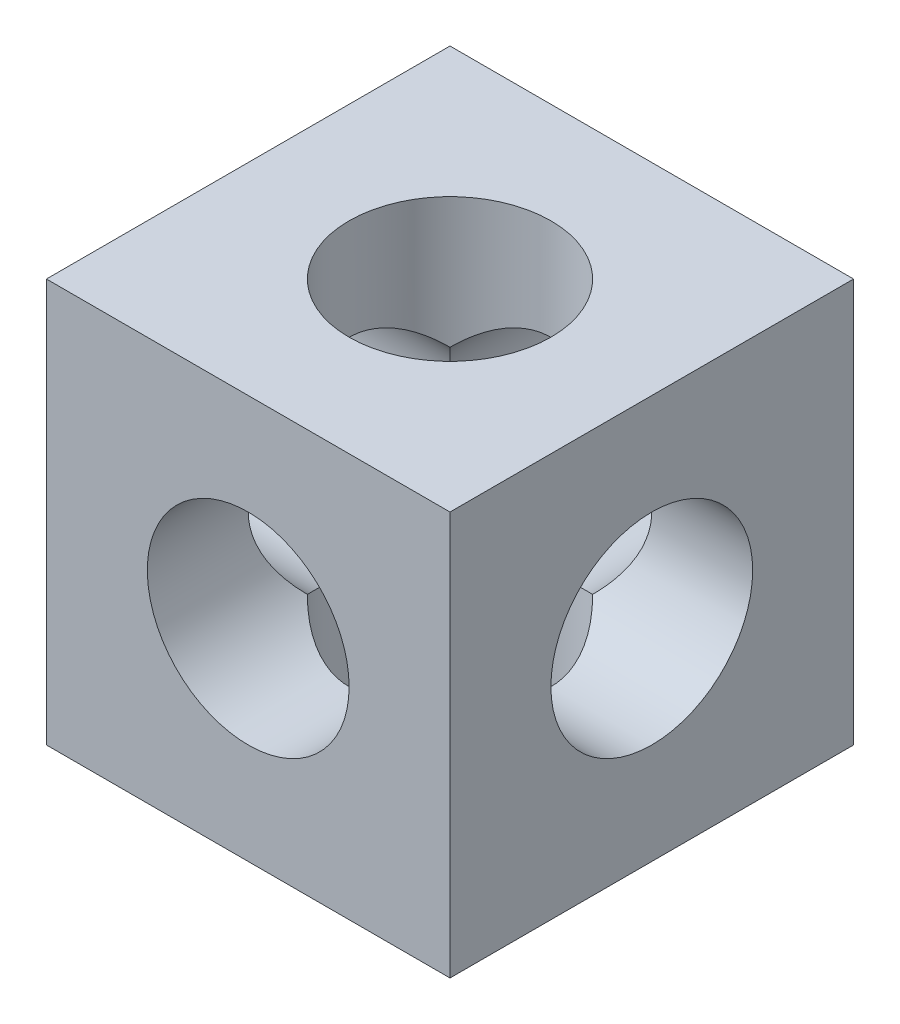
ISO-10303-21;
HEADER;
FILE_DESCRIPTION(('STEP AP214'),'2;1');
FILE_NAME('part.step','',(''),(''),'','','');
FILE_SCHEMA(('AUTOMOTIVE_DESIGN { 1 0 10303 214 1 1 1 1 }'));
ENDSEC;
DATA;
#1=APPLICATION_CONTEXT('core data for automotive mechanical design processes');
#2=APPLICATION_PROTOCOL_DEFINITION('international standard','automotive_design',2000,#1);
#3=PRODUCT_CONTEXT('',#1,'mechanical');
#4=PRODUCT('Part','Part','',(#3));
#5=PRODUCT_RELATED_PRODUCT_CATEGORY('part','',(#4));
#6=PRODUCT_DEFINITION_FORMATION('','',#4);
#7=PRODUCT_DEFINITION_CONTEXT('part definition',#1,'design');
#8=PRODUCT_DEFINITION('design','',#6,#7);
#9=PRODUCT_DEFINITION_SHAPE('','',#8);
#10=(LENGTH_UNIT() NAMED_UNIT(*) SI_UNIT(.MILLI.,.METRE.));
#11=(NAMED_UNIT(*) PLANE_ANGLE_UNIT() SI_UNIT($,.RADIAN.));
#12=(NAMED_UNIT(*) SI_UNIT($,.STERADIAN.) SOLID_ANGLE_UNIT());
#13=UNCERTAINTY_MEASURE_WITH_UNIT(LENGTH_MEASURE(1.E-05),#10,'distance_accuracy_value','');
#14=(GEOMETRIC_REPRESENTATION_CONTEXT(3) GLOBAL_UNCERTAINTY_ASSIGNED_CONTEXT((#13)) GLOBAL_UNIT_ASSIGNED_CONTEXT((#10,
#11,#12)) REPRESENTATION_CONTEXT('',''));
#15=CARTESIAN_POINT('',(0.,0.,0.));
#16=DIRECTION('',(0.,0.,1.));
#17=DIRECTION('',(1.,0.,0.));
#18=AXIS2_PLACEMENT_3D('',#15,#16,#17);
#19=CARTESIAN_POINT('',(5.,0.,0.));
#20=DIRECTION('',(-1.,0.,0.));
#21=DIRECTION('',(0.,-1.,0.));
#22=AXIS2_PLACEMENT_3D('',#19,#20,#21);
#23=CYLINDRICAL_SURFACE('',#22,1.5);
#24=CARTESIAN_POINT('',(-3.,0.,0.));
#25=DIRECTION('',(-1.,0.,0.));
#26=DIRECTION('',(0.,-1.,0.));
#27=AXIS2_PLACEMENT_3D('',#24,#25,#26);
#28=CIRCLE('',#27,1.5);
#29=CARTESIAN_POINT('',(-3.,-1.5,0.));
#30=VERTEX_POINT('',#29);
#31=EDGE_CURVE('E185',#30,#30,#28,.T.);
#32=ORIENTED_EDGE('',*,*,#31,.T.);
#33=EDGE_LOOP('',(#32));
#34=FACE_BOUND('',#33,.T.);
#35=CARTESIAN_POINT('',(0.,0.,0.));
#36=DIRECTION('',(-0.707106781186547,-0.707106781186548,0.));
#37=DIRECTION('',(-0.707106781186548,0.707106781186547,0.));
#38=AXIS2_PLACEMENT_3D('',#35,#36,#37);
#39=ELLIPSE('',#38,2.12132034355964,1.5);
#40=CARTESIAN_POINT('',(-1.06066017177982,1.06066017177982,-1.06066017177982));
#41=VERTEX_POINT('',#40);
#42=CARTESIAN_POINT('',(-1.06066017177982,1.06066017177982,1.06066017177982));
#43=VERTEX_POINT('',#42);
#44=EDGE_CURVE('E121',#41,#43,#39,.F.);
#45=ORIENTED_EDGE('',*,*,#44,.T.);
#46=CARTESIAN_POINT('',(0.,0.,0.));
#47=DIRECTION('',(-0.707106781186547,0.,-0.707106781186547));
#48=DIRECTION('',(-0.707106781186547,0.,0.707106781186547));
#49=AXIS2_PLACEMENT_3D('',#46,#47,#48);
#50=ELLIPSE('',#49,2.12132034355964,1.5);
#51=CARTESIAN_POINT('',(-1.06066017177982,-1.06066017177982,1.06066017177982));
#52=VERTEX_POINT('',#51);
#53=EDGE_CURVE('E109',#43,#52,#50,.F.);
#54=ORIENTED_EDGE('',*,*,#53,.T.);
#55=CARTESIAN_POINT('',(0.,0.,0.));
#56=DIRECTION('',(-0.707106781186548,0.707106781186547,0.));
#57=DIRECTION('',(-0.707106781186547,-0.707106781186548,0.));
#58=AXIS2_PLACEMENT_3D('',#55,#56,#57);
#59=ELLIPSE('',#58,2.12132034355964,1.5);
#60=CARTESIAN_POINT('',(-1.06066017177982,-1.06066017177982,-1.06066017177982));
#61=VERTEX_POINT('',#60);
#62=EDGE_CURVE('E116',#52,#61,#59,.F.);
#63=ORIENTED_EDGE('',*,*,#62,.T.);
#64=CARTESIAN_POINT('',(0.,0.,0.));
#65=DIRECTION('',(-0.707106781186547,0.,0.707106781186547));
#66=DIRECTION('',(-0.707106781186547,0.,-0.707106781186547));
#67=AXIS2_PLACEMENT_3D('',#64,#65,#66);
#68=ELLIPSE('',#67,2.12132034355964,1.5);
#69=EDGE_CURVE('E61',#61,#41,#68,.F.);
#70=ORIENTED_EDGE('',*,*,#69,.T.);
#71=EDGE_LOOP('',(#45,#54,#63,#70));
#72=FACE_BOUND('',#71,.T.);
#73=ADVANCED_FACE('F45',(#34,#72),#23,.F.);
#74=CARTESIAN_POINT('',(3.,3.,3.));
#75=DIRECTION('',(-1.,0.,0.));
#76=DIRECTION('',(0.,-1.,0.));
#77=AXIS2_PLACEMENT_3D('',#74,#75,#76);
#78=PLANE('',#77);
#79=CARTESIAN_POINT('',(3.,0.,0.));
#80=DIRECTION('',(-1.,0.,0.));
#81=DIRECTION('',(0.,-1.,0.));
#82=AXIS2_PLACEMENT_3D('',#79,#80,#81);
#83=CIRCLE('',#82,1.5);
#84=CARTESIAN_POINT('',(3.,-1.5,0.));
#85=VERTEX_POINT('',#84);
#86=EDGE_CURVE('E170',#85,#85,#83,.T.);
#87=ORIENTED_EDGE('',*,*,#86,.T.);
#88=EDGE_LOOP('',(#87));
#89=FACE_BOUND('',#88,.T.);
#90=DIRECTION('',(0.,1.,0.));
#91=VECTOR('',#90,1.);
#92=CARTESIAN_POINT('',(3.,3.,-3.));
#93=LINE('',#92,#91);
#94=CARTESIAN_POINT('',(3.,-3.,-3.));
#95=VERTEX_POINT('',#94);
#96=CARTESIAN_POINT('',(3.,3.,-3.));
#97=VERTEX_POINT('',#96);
#98=EDGE_CURVE('E166',#95,#97,#93,.T.);
#99=ORIENTED_EDGE('',*,*,#98,.T.);
#100=DIRECTION('',(0.,0.,-1.));
#101=VECTOR('',#100,1.);
#102=CARTESIAN_POINT('',(3.,3.,3.));
#103=LINE('',#102,#101);
#104=CARTESIAN_POINT('',(3.,3.,3.));
#105=VERTEX_POINT('',#104);
#106=EDGE_CURVE('E139',#105,#97,#103,.T.);
#107=ORIENTED_EDGE('',*,*,#106,.F.);
#108=DIRECTION('',(0.,1.,0.));
#109=VECTOR('',#108,1.);
#110=CARTESIAN_POINT('',(3.,3.,3.));
#111=LINE('',#110,#109);
#112=CARTESIAN_POINT('',(3.,-3.,3.));
#113=VERTEX_POINT('',#112);
#114=EDGE_CURVE('E159',#113,#105,#111,.T.);
#115=ORIENTED_EDGE('',*,*,#114,.F.);
#116=DIRECTION('',(0.,0.,-1.));
#117=VECTOR('',#116,1.);
#118=CARTESIAN_POINT('',(3.,-3.,3.));
#119=LINE('',#118,#117);
#120=EDGE_CURVE('E151',#113,#95,#119,.T.);
#121=ORIENTED_EDGE('',*,*,#120,.T.);
#122=EDGE_LOOP('',(#99,#107,#115,#121));
#123=FACE_BOUND('',#122,.T.);
#124=ADVANCED_FACE('F47',(#89,#123),#78,.F.);
#125=CARTESIAN_POINT('',(-3.,3.,3.));
#126=DIRECTION('',(0.,-1.,0.));
#127=DIRECTION('',(0.,0.,-1.));
#128=AXIS2_PLACEMENT_3D('',#125,#126,#127);
#129=PLANE('',#128);
#130=CARTESIAN_POINT('',(0.,3.,0.));
#131=DIRECTION('',(0.,1.,0.));
#132=DIRECTION('',(0.,0.,1.));
#133=AXIS2_PLACEMENT_3D('',#130,#131,#132);
#134=CIRCLE('',#133,1.5);
#135=CARTESIAN_POINT('',(0.,3.,1.5));
#136=VERTEX_POINT('',#135);
#137=EDGE_CURVE('E193',#136,#136,#134,.T.);
#138=ORIENTED_EDGE('',*,*,#137,.F.);
#139=EDGE_LOOP('',(#138));
#140=FACE_BOUND('',#139,.T.);
#141=DIRECTION('',(-1.,0.,0.));
#142=VECTOR('',#141,1.);
#143=CARTESIAN_POINT('',(-3.,3.,-3.));
#144=LINE('',#143,#142);
#145=CARTESIAN_POINT('',(-3.,3.,-3.));
#146=VERTEX_POINT('',#145);
#147=EDGE_CURVE('E163',#97,#146,#144,.T.);
#148=ORIENTED_EDGE('',*,*,#147,.T.);
#149=DIRECTION('',(0.,0.,-1.));
#150=VECTOR('',#149,1.);
#151=CARTESIAN_POINT('',(-3.,3.,3.));
#152=LINE('',#151,#150);
#153=CARTESIAN_POINT('',(-3.,3.,3.));
#154=VERTEX_POINT('',#153);
#155=EDGE_CURVE('E143',#154,#146,#152,.T.);
#156=ORIENTED_EDGE('',*,*,#155,.F.);
#157=DIRECTION('',(-1.,0.,0.));
#158=VECTOR('',#157,1.);
#159=CARTESIAN_POINT('',(-3.,3.,3.));
#160=LINE('',#159,#158);
#161=EDGE_CURVE('E176',#105,#154,#160,.T.);
#162=ORIENTED_EDGE('',*,*,#161,.F.);
#163=ORIENTED_EDGE('',*,*,#106,.T.);
#164=EDGE_LOOP('',(#148,#156,#162,#163));
#165=FACE_BOUND('',#164,.T.);
#166=ADVANCED_FACE('F244',(#140,#165),#129,.F.);
#167=CARTESIAN_POINT('',(-3.,3.,3.));
#168=DIRECTION('',(1.,0.,0.));
#169=DIRECTION('',(0.,1.,0.));
#170=AXIS2_PLACEMENT_3D('',#167,#168,#169);
#171=PLANE('',#170);
#172=ORIENTED_EDGE('',*,*,#31,.F.);
#173=EDGE_LOOP('',(#172));
#174=FACE_BOUND('',#173,.T.);
#175=DIRECTION('',(0.,-1.,0.));
#176=VECTOR('',#175,1.);
#177=CARTESIAN_POINT('',(-3.,3.,-3.));
#178=LINE('',#177,#176);
#179=CARTESIAN_POINT('',(-3.,-3.,-3.));
#180=VERTEX_POINT('',#179);
#181=EDGE_CURVE('E160',#146,#180,#178,.T.);
#182=ORIENTED_EDGE('',*,*,#181,.T.);
#183=DIRECTION('',(0.,0.,-1.));
#184=VECTOR('',#183,1.);
#185=CARTESIAN_POINT('',(-3.,-3.,3.));
#186=LINE('',#185,#184);
#187=CARTESIAN_POINT('',(-3.,-3.,3.));
#188=VERTEX_POINT('',#187);
#189=EDGE_CURVE('E147',#188,#180,#186,.T.);
#190=ORIENTED_EDGE('',*,*,#189,.F.);
#191=DIRECTION('',(0.,-1.,0.));
#192=VECTOR('',#191,1.);
#193=CARTESIAN_POINT('',(-3.,3.,3.));
#194=LINE('',#193,#192);
#195=EDGE_CURVE('E173',#154,#188,#194,.T.);
#196=ORIENTED_EDGE('',*,*,#195,.F.);
#197=ORIENTED_EDGE('',*,*,#155,.T.);
#198=EDGE_LOOP('',(#182,#190,#196,#197));
#199=FACE_BOUND('',#198,.T.);
#200=ADVANCED_FACE('F241',(#174,#199),#171,.F.);
#201=CARTESIAN_POINT('',(-3.,-3.,3.));
#202=DIRECTION('',(0.,1.,0.));
#203=DIRECTION('',(0.,0.,1.));
#204=AXIS2_PLACEMENT_3D('',#201,#202,#203);
#205=PLANE('',#204);
#206=CARTESIAN_POINT('',(0.,-3.,0.));
#207=DIRECTION('',(0.,1.,0.));
#208=DIRECTION('',(0.,0.,1.));
#209=AXIS2_PLACEMENT_3D('',#206,#207,#208);
#210=CIRCLE('',#209,1.5);
#211=CARTESIAN_POINT('',(0.,-3.,1.5));
#212=VERTEX_POINT('',#211);
#213=EDGE_CURVE('E189',#212,#212,#210,.T.);
#214=ORIENTED_EDGE('',*,*,#213,.T.);
#215=EDGE_LOOP('',(#214));
#216=FACE_BOUND('',#215,.T.);
#217=DIRECTION('',(1.,0.,0.));
#218=VECTOR('',#217,1.);
#219=CARTESIAN_POINT('',(-3.,-3.,-3.));
#220=LINE('',#219,#218);
#221=EDGE_CURVE('E156',#180,#95,#220,.T.);
#222=ORIENTED_EDGE('',*,*,#221,.T.);
#223=ORIENTED_EDGE('',*,*,#120,.F.);
#224=DIRECTION('',(1.,0.,0.));
#225=VECTOR('',#224,1.);
#226=CARTESIAN_POINT('',(-3.,-3.,3.));
#227=LINE('',#226,#225);
#228=EDGE_CURVE('E155',#188,#113,#227,.T.);
#229=ORIENTED_EDGE('',*,*,#228,.F.);
#230=ORIENTED_EDGE('',*,*,#189,.T.);
#231=EDGE_LOOP('',(#222,#223,#229,#230));
#232=FACE_BOUND('',#231,.T.);
#233=ADVANCED_FACE('F237',(#216,#232),#205,.F.);
#234=CARTESIAN_POINT('',(0.,0.,3.));
#235=DIRECTION('',(0.,0.,1.));
#236=DIRECTION('',(1.,0.,0.));
#237=AXIS2_PLACEMENT_3D('',#234,#235,#236);
#238=PLANE('',#237);
#239=CARTESIAN_POINT('',(0.,0.,3.));
#240=DIRECTION('',(0.,0.,1.));
#241=DIRECTION('',(1.,0.,0.));
#242=AXIS2_PLACEMENT_3D('',#239,#240,#241);
#243=CIRCLE('',#242,1.5);
#244=CARTESIAN_POINT('',(1.5,0.,3.));
#245=VERTEX_POINT('',#244);
#246=EDGE_CURVE('E197',#245,#245,#243,.T.);
#247=ORIENTED_EDGE('',*,*,#246,.F.);
#248=EDGE_LOOP('',(#247));
#249=FACE_BOUND('',#248,.T.);
#250=ORIENTED_EDGE('',*,*,#114,.T.);
#251=ORIENTED_EDGE('',*,*,#161,.T.);
#252=ORIENTED_EDGE('',*,*,#195,.T.);
#253=ORIENTED_EDGE('',*,*,#228,.T.);
#254=EDGE_LOOP('',(#250,#251,#252,#253));
#255=FACE_BOUND('',#254,.T.);
#256=ADVANCED_FACE('F226',(#249,#255),#238,.T.);
#257=CARTESIAN_POINT('',(0.,0.,-3.));
#258=DIRECTION('',(0.,0.,1.));
#259=DIRECTION('',(1.,0.,0.));
#260=AXIS2_PLACEMENT_3D('',#257,#258,#259);
#261=PLANE('',#260);
#262=CARTESIAN_POINT('',(0.,0.,-3.));
#263=DIRECTION('',(0.,0.,-1.));
#264=DIRECTION('',(-1.,0.,0.));
#265=AXIS2_PLACEMENT_3D('',#262,#263,#264);
#266=CIRCLE('',#265,1.5);
#267=CARTESIAN_POINT('',(-1.5,0.,-3.));
#268=VERTEX_POINT('',#267);
#269=EDGE_CURVE('E215',#268,#268,#266,.T.);
#270=ORIENTED_EDGE('',*,*,#269,.F.);
#271=EDGE_LOOP('',(#270));
#272=FACE_BOUND('',#271,.T.);
#273=ORIENTED_EDGE('',*,*,#98,.F.);
#274=ORIENTED_EDGE('',*,*,#221,.F.);
#275=ORIENTED_EDGE('',*,*,#181,.F.);
#276=ORIENTED_EDGE('',*,*,#147,.F.);
#277=EDGE_LOOP('',(#273,#274,#275,#276));
#278=FACE_BOUND('',#277,.T.);
#279=ADVANCED_FACE('F222',(#272,#278),#261,.F.);
#280=CARTESIAN_POINT('',(0.,0.,0.));
#281=DIRECTION('',(-0.707106781186548,0.707106781186547,0.));
#282=DIRECTION('',(-0.707106781186547,-0.707106781186548,0.));
#283=AXIS2_PLACEMENT_3D('',#280,#281,#282);
#284=ELLIPSE('',#283,2.12132034355964,1.5);
#285=CARTESIAN_POINT('',(1.06066017177982,1.06066017177982,1.06066017177982));
#286=VERTEX_POINT('',#285);
#287=CARTESIAN_POINT('',(1.06066017177982,1.06066017177982,-1.06066017177982));
#288=VERTEX_POINT('',#287);
#289=EDGE_CURVE('E128',#286,#288,#284,.T.);
#290=ORIENTED_EDGE('',*,*,#289,.T.);
#291=CARTESIAN_POINT('',(0.,0.,0.));
#292=DIRECTION('',(-0.707106781186547,0.,-0.707106781186547));
#293=DIRECTION('',(-0.707106781186547,0.,0.707106781186547));
#294=AXIS2_PLACEMENT_3D('',#291,#292,#293);
#295=ELLIPSE('',#294,2.12132034355964,1.5);
#296=CARTESIAN_POINT('',(1.06066017177982,-1.06066017177982,-1.06066017177982));
#297=VERTEX_POINT('',#296);
#298=EDGE_CURVE('E207',#288,#297,#295,.T.);
#299=ORIENTED_EDGE('',*,*,#298,.T.);
#300=CARTESIAN_POINT('',(0.,0.,0.));
#301=DIRECTION('',(-0.707106781186547,-0.707106781186548,0.));
#302=DIRECTION('',(-0.707106781186548,0.707106781186547,0.));
#303=AXIS2_PLACEMENT_3D('',#300,#301,#302);
#304=ELLIPSE('',#303,2.12132034355964,1.5);
#305=CARTESIAN_POINT('',(1.06066017177982,-1.06066017177982,1.06066017177982));
#306=VERTEX_POINT('',#305);
#307=EDGE_CURVE('E132',#297,#306,#304,.T.);
#308=ORIENTED_EDGE('',*,*,#307,.T.);
#309=CARTESIAN_POINT('',(0.,0.,0.));
#310=DIRECTION('',(-0.707106781186547,0.,0.707106781186547));
#311=DIRECTION('',(-0.707106781186547,0.,-0.707106781186547));
#312=AXIS2_PLACEMENT_3D('',#309,#310,#311);
#313=ELLIPSE('',#312,2.12132034355964,1.5);
#314=EDGE_CURVE('E68',#306,#286,#313,.T.);
#315=ORIENTED_EDGE('',*,*,#314,.T.);
#316=EDGE_LOOP('',(#290,#299,#308,#315));
#317=FACE_BOUND('',#316,.T.);
#318=ORIENTED_EDGE('',*,*,#86,.F.);
#319=EDGE_LOOP('',(#318));
#320=FACE_BOUND('',#319,.T.);
#321=ADVANCED_FACE('F225',(#317,#320),#23,.F.);
#322=CARTESIAN_POINT('',(0.,-5.,0.));
#323=DIRECTION('',(0.,1.,0.));
#324=DIRECTION('',(0.,0.,1.));
#325=AXIS2_PLACEMENT_3D('',#322,#323,#324);
#326=CYLINDRICAL_SURFACE('',#325,1.5);
#327=ORIENTED_EDGE('',*,*,#137,.T.);
#328=EDGE_LOOP('',(#327));
#329=FACE_BOUND('',#328,.T.);
#330=ORIENTED_EDGE('',*,*,#289,.F.);
#331=CARTESIAN_POINT('',(0.,0.,0.));
#332=DIRECTION('',(0.,0.707106781186547,-0.707106781186547));
#333=DIRECTION('',(0.,0.707106781186547,0.707106781186547));
#334=AXIS2_PLACEMENT_3D('',#331,#332,#333);
#335=ELLIPSE('',#334,2.12132034355964,1.5);
#336=EDGE_CURVE('E123',#286,#43,#335,.F.);
#337=ORIENTED_EDGE('',*,*,#336,.T.);
#338=ORIENTED_EDGE('',*,*,#44,.F.);
#339=CARTESIAN_POINT('',(0.,0.,0.));
#340=DIRECTION('',(0.,0.707106781186547,0.707106781186547));
#341=DIRECTION('',(0.,0.707106781186547,-0.707106781186547));
#342=AXIS2_PLACEMENT_3D('',#339,#340,#341);
#343=ELLIPSE('',#342,2.12132034355964,1.5);
#344=EDGE_CURVE('E201',#41,#288,#343,.F.);
#345=ORIENTED_EDGE('',*,*,#344,.T.);
#346=EDGE_LOOP('',(#330,#337,#338,#345));
#347=FACE_BOUND('',#346,.T.);
#348=ADVANCED_FACE('F264',(#329,#347),#326,.F.);
#349=ORIENTED_EDGE('',*,*,#307,.F.);
#350=CARTESIAN_POINT('',(0.,0.,0.));
#351=DIRECTION('',(0.,0.707106781186547,-0.707106781186547));
#352=DIRECTION('',(0.,0.707106781186547,0.707106781186547));
#353=AXIS2_PLACEMENT_3D('',#350,#351,#352);
#354=ELLIPSE('',#353,2.12132034355964,1.5);
#355=EDGE_CURVE('E11',#297,#61,#354,.T.);
#356=ORIENTED_EDGE('',*,*,#355,.T.);
#357=ORIENTED_EDGE('',*,*,#62,.F.);
#358=CARTESIAN_POINT('',(0.,0.,0.));
#359=DIRECTION('',(0.,0.707106781186547,0.707106781186547));
#360=DIRECTION('',(0.,0.707106781186547,-0.707106781186547));
#361=AXIS2_PLACEMENT_3D('',#358,#359,#360);
#362=ELLIPSE('',#361,2.12132034355964,1.5);
#363=EDGE_CURVE('E54',#52,#306,#362,.T.);
#364=ORIENTED_EDGE('',*,*,#363,.T.);
#365=EDGE_LOOP('',(#349,#356,#357,#364));
#366=FACE_BOUND('',#365,.T.);
#367=ORIENTED_EDGE('',*,*,#213,.F.);
#368=EDGE_LOOP('',(#367));
#369=FACE_BOUND('',#368,.T.);
#370=ADVANCED_FACE('F125',(#366,#369),#326,.F.);
#371=CARTESIAN_POINT('',(0.,0.,5.));
#372=DIRECTION('',(0.,0.,-1.));
#373=DIRECTION('',(-1.,0.,0.));
#374=AXIS2_PLACEMENT_3D('',#371,#372,#373);
#375=CYLINDRICAL_SURFACE('',#374,1.5);
#376=ORIENTED_EDGE('',*,*,#246,.T.);
#377=EDGE_LOOP('',(#376));
#378=FACE_BOUND('',#377,.T.);
#379=ORIENTED_EDGE('',*,*,#314,.F.);
#380=ORIENTED_EDGE('',*,*,#363,.F.);
#381=ORIENTED_EDGE('',*,*,#53,.F.);
#382=ORIENTED_EDGE('',*,*,#336,.F.);
#383=EDGE_LOOP('',(#379,#380,#381,#382));
#384=FACE_BOUND('',#383,.T.);
#385=ADVANCED_FACE('F108',(#378,#384),#375,.F.);
#386=ORIENTED_EDGE('',*,*,#269,.T.);
#387=EDGE_LOOP('',(#386));
#388=FACE_BOUND('',#387,.T.);
#389=ORIENTED_EDGE('',*,*,#69,.F.);
#390=ORIENTED_EDGE('',*,*,#355,.F.);
#391=ORIENTED_EDGE('',*,*,#298,.F.);
#392=ORIENTED_EDGE('',*,*,#344,.F.);
#393=EDGE_LOOP('',(#389,#390,#391,#392));
#394=FACE_BOUND('',#393,.T.);
#395=ADVANCED_FACE('F220',(#388,#394),#375,.F.);
#396=CLOSED_SHELL('',(#73,#124,#166,#200,#233,#256,#279,#321,#348,#370,#385,#395));
#397=MANIFOLD_SOLID_BREP('B2',#396);
#398=ADVANCED_BREP_SHAPE_REPRESENTATION('',(#18,#397),#14);
#399=SHAPE_DEFINITION_REPRESENTATION(#9,#398);
ENDSEC;
END-ISO-10303-21;
